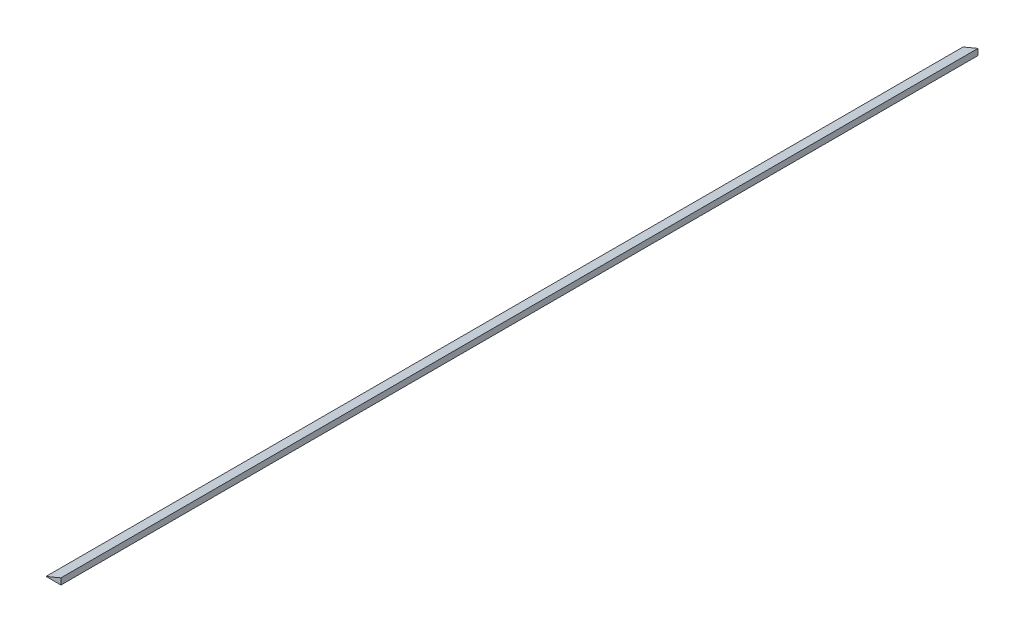
ISO-10303-21;
HEADER;
FILE_DESCRIPTION(('STEP AP214'),'2;1');
FILE_NAME('part.step','',(''),(''),'','','');
FILE_SCHEMA(('AUTOMOTIVE_DESIGN { 1 0 10303 214 1 1 1 1 }'));
ENDSEC;
DATA;
#1=APPLICATION_CONTEXT('core data for automotive mechanical design processes');
#2=APPLICATION_PROTOCOL_DEFINITION('international standard','automotive_design',2000,#1);
#3=PRODUCT_CONTEXT('',#1,'mechanical');
#4=PRODUCT('Part','Part','',(#3));
#5=PRODUCT_RELATED_PRODUCT_CATEGORY('part','',(#4));
#6=PRODUCT_DEFINITION_FORMATION('','',#4);
#7=PRODUCT_DEFINITION_CONTEXT('part definition',#1,'design');
#8=PRODUCT_DEFINITION('design','',#6,#7);
#9=PRODUCT_DEFINITION_SHAPE('','',#8);
#10=(LENGTH_UNIT() NAMED_UNIT(*) SI_UNIT(.MILLI.,.METRE.));
#11=(NAMED_UNIT(*) PLANE_ANGLE_UNIT() SI_UNIT($,.RADIAN.));
#12=(NAMED_UNIT(*) SI_UNIT($,.STERADIAN.) SOLID_ANGLE_UNIT());
#13=UNCERTAINTY_MEASURE_WITH_UNIT(LENGTH_MEASURE(1.E-05),#10,'distance_accuracy_value','');
#14=(GEOMETRIC_REPRESENTATION_CONTEXT(3) GLOBAL_UNCERTAINTY_ASSIGNED_CONTEXT((#13)) GLOBAL_UNIT_ASSIGNED_CONTEXT((#10,
#11,#12)) REPRESENTATION_CONTEXT('',''));
#15=CARTESIAN_POINT('',(0.,0.,0.));
#16=DIRECTION('',(0.,0.,1.));
#17=DIRECTION('',(1.,0.,0.));
#18=AXIS2_PLACEMENT_3D('',#15,#16,#17);
#19=CARTESIAN_POINT('',(19.05,7.9375,1168.4));
#20=DIRECTION('',(0.384615384615385,-0.923076923076923,0.));
#21=DIRECTION('',(0.923076923076923,0.384615384615385,0.));
#22=AXIS2_PLACEMENT_3D('',#19,#20,#21);
#23=PLANE('',#22);
#24=DIRECTION('',(-0.923076923076923,-0.384615384615385,0.));
#25=VECTOR('',#24,1.);
#26=CARTESIAN_POINT('',(19.05,7.9375,0.));
#27=LINE('',#26,#25);
#28=CARTESIAN_POINT('',(19.05,7.9375,0.));
#29=VERTEX_POINT('',#28);
#30=CARTESIAN_POINT('',(0.,0.,0.));
#31=VERTEX_POINT('',#30);
#32=EDGE_CURVE('E89',#29,#31,#27,.T.);
#33=ORIENTED_EDGE('',*,*,#32,.T.);
#34=DIRECTION('',(0.,0.,-1.));
#35=VECTOR('',#34,1.);
#36=CARTESIAN_POINT('',(0.,0.,1168.4));
#37=LINE('',#36,#35);
#38=CARTESIAN_POINT('',(0.,0.,1168.4));
#39=VERTEX_POINT('',#38);
#40=EDGE_CURVE('E11',#39,#31,#37,.T.);
#41=ORIENTED_EDGE('',*,*,#40,.F.);
#42=DIRECTION('',(-0.923076923076923,-0.384615384615385,0.));
#43=VECTOR('',#42,1.);
#44=CARTESIAN_POINT('',(19.05,7.9375,1168.4));
#45=LINE('',#44,#43);
#46=CARTESIAN_POINT('',(19.05,7.9375,1168.4));
#47=VERTEX_POINT('',#46);
#48=EDGE_CURVE('E81',#47,#39,#45,.T.);
#49=ORIENTED_EDGE('',*,*,#48,.F.);
#50=DIRECTION('',(0.,0.,-1.));
#51=VECTOR('',#50,1.);
#52=CARTESIAN_POINT('',(19.05,7.9375,1168.4));
#53=LINE('',#52,#51);
#54=EDGE_CURVE('E90',#47,#29,#53,.T.);
#55=ORIENTED_EDGE('',*,*,#54,.T.);
#56=EDGE_LOOP('',(#33,#41,#49,#55));
#57=FACE_BOUND('',#56,.T.);
#58=ADVANCED_FACE('F39',(#57),#23,.F.);
#59=CARTESIAN_POINT('',(0.,0.,1168.4));
#60=DIRECTION('',(0.,1.,0.));
#61=DIRECTION('',(0.,0.,1.));
#62=AXIS2_PLACEMENT_3D('',#59,#60,#61);
#63=PLANE('',#62);
#64=DIRECTION('',(1.,0.,0.));
#65=VECTOR('',#64,1.);
#66=CARTESIAN_POINT('',(0.,0.,0.));
#67=LINE('',#66,#65);
#68=CARTESIAN_POINT('',(19.05,0.,0.));
#69=VERTEX_POINT('',#68);
#70=EDGE_CURVE('E68',#31,#69,#67,.T.);
#71=ORIENTED_EDGE('',*,*,#70,.T.);
#72=DIRECTION('',(0.,0.,-1.));
#73=VECTOR('',#72,1.);
#74=CARTESIAN_POINT('',(19.05,0.,1168.4));
#75=LINE('',#74,#73);
#76=CARTESIAN_POINT('',(19.05,0.,1168.4));
#77=VERTEX_POINT('',#76);
#78=EDGE_CURVE('E48',#77,#69,#75,.T.);
#79=ORIENTED_EDGE('',*,*,#78,.F.);
#80=DIRECTION('',(1.,0.,0.));
#81=VECTOR('',#80,1.);
#82=CARTESIAN_POINT('',(0.,0.,1168.4));
#83=LINE('',#82,#81);
#84=EDGE_CURVE('E76',#39,#77,#83,.T.);
#85=ORIENTED_EDGE('',*,*,#84,.F.);
#86=ORIENTED_EDGE('',*,*,#40,.T.);
#87=EDGE_LOOP('',(#71,#79,#85,#86));
#88=FACE_BOUND('',#87,.T.);
#89=ADVANCED_FACE('F77',(#88),#63,.F.);
#90=CARTESIAN_POINT('',(19.05,0.,1168.4));
#91=DIRECTION('',(-1.,0.,0.));
#92=DIRECTION('',(0.,0.,1.));
#93=AXIS2_PLACEMENT_3D('',#90,#91,#92);
#94=PLANE('',#93);
#95=DIRECTION('',(0.,1.,0.));
#96=VECTOR('',#95,1.);
#97=CARTESIAN_POINT('',(19.05,0.,0.));
#98=LINE('',#97,#96);
#99=EDGE_CURVE('E73',#69,#29,#98,.T.);
#100=ORIENTED_EDGE('',*,*,#99,.T.);
#101=ORIENTED_EDGE('',*,*,#54,.F.);
#102=DIRECTION('',(0.,1.,0.));
#103=VECTOR('',#102,1.);
#104=CARTESIAN_POINT('',(19.05,0.,1168.4));
#105=LINE('',#104,#103);
#106=EDGE_CURVE('E56',#77,#47,#105,.T.);
#107=ORIENTED_EDGE('',*,*,#106,.F.);
#108=ORIENTED_EDGE('',*,*,#78,.T.);
#109=EDGE_LOOP('',(#100,#101,#107,#108));
#110=FACE_BOUND('',#109,.T.);
#111=ADVANCED_FACE('F102',(#110),#94,.F.);
#112=CARTESIAN_POINT('',(0.,0.,1168.4));
#113=DIRECTION('',(0.,0.,-1.));
#114=DIRECTION('',(-1.,0.,0.));
#115=AXIS2_PLACEMENT_3D('',#112,#113,#114);
#116=PLANE('',#115);
#117=ORIENTED_EDGE('',*,*,#48,.T.);
#118=ORIENTED_EDGE('',*,*,#84,.T.);
#119=ORIENTED_EDGE('',*,*,#106,.T.);
#120=EDGE_LOOP('',(#117,#118,#119));
#121=FACE_BOUND('',#120,.T.);
#122=ADVANCED_FACE('F84',(#121),#116,.F.);
#123=CARTESIAN_POINT('',(0.,0.,0.));
#124=DIRECTION('',(0.,0.,-1.));
#125=DIRECTION('',(-1.,0.,0.));
#126=AXIS2_PLACEMENT_3D('',#123,#124,#125);
#127=PLANE('',#126);
#128=ORIENTED_EDGE('',*,*,#32,.F.);
#129=ORIENTED_EDGE('',*,*,#99,.F.);
#130=ORIENTED_EDGE('',*,*,#70,.F.);
#131=EDGE_LOOP('',(#128,#129,#130));
#132=FACE_BOUND('',#131,.T.);
#133=ADVANCED_FACE('F103',(#132),#127,.T.);
#134=CLOSED_SHELL('',(#58,#89,#111,#122,#133));
#135=MANIFOLD_SOLID_BREP('B2',#134);
#136=ADVANCED_BREP_SHAPE_REPRESENTATION('',(#18,#135),#14);
#137=SHAPE_DEFINITION_REPRESENTATION(#9,#136);
ENDSEC;
END-ISO-10303-21;
